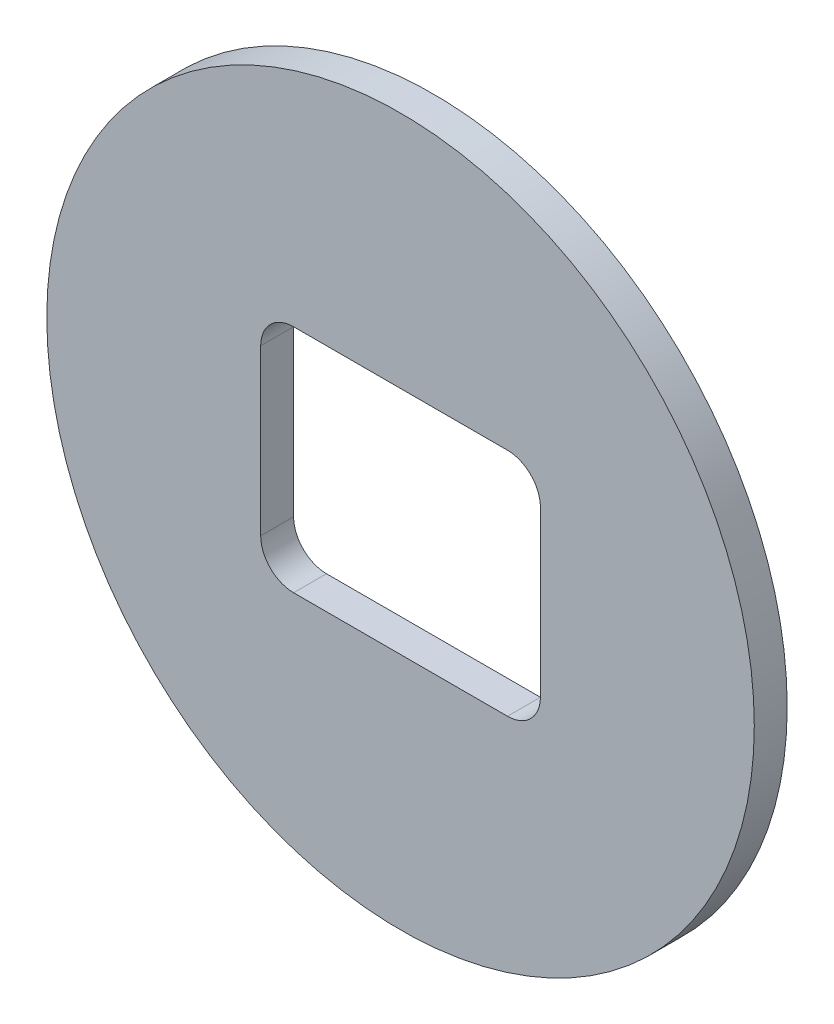
ISO-10303-21;
HEADER;
FILE_DESCRIPTION(('STEP AP214'),'2;1');
FILE_NAME('part.step','',(''),(''),'','','');
FILE_SCHEMA(('AUTOMOTIVE_DESIGN { 1 0 10303 214 1 1 1 1 }'));
ENDSEC;
DATA;
#1=APPLICATION_CONTEXT('core data for automotive mechanical design processes');
#2=APPLICATION_PROTOCOL_DEFINITION('international standard','automotive_design',2000,#1);
#3=PRODUCT_CONTEXT('',#1,'mechanical');
#4=PRODUCT('Part','Part','',(#3));
#5=PRODUCT_RELATED_PRODUCT_CATEGORY('part','',(#4));
#6=PRODUCT_DEFINITION_FORMATION('','',#4);
#7=PRODUCT_DEFINITION_CONTEXT('part definition',#1,'design');
#8=PRODUCT_DEFINITION('design','',#6,#7);
#9=PRODUCT_DEFINITION_SHAPE('','',#8);
#10=(LENGTH_UNIT() NAMED_UNIT(*) SI_UNIT(.MILLI.,.METRE.));
#11=(NAMED_UNIT(*) PLANE_ANGLE_UNIT() SI_UNIT($,.RADIAN.));
#12=(NAMED_UNIT(*) SI_UNIT($,.STERADIAN.) SOLID_ANGLE_UNIT());
#13=UNCERTAINTY_MEASURE_WITH_UNIT(LENGTH_MEASURE(1.E-05),#10,'distance_accuracy_value','');
#14=(GEOMETRIC_REPRESENTATION_CONTEXT(3) GLOBAL_UNCERTAINTY_ASSIGNED_CONTEXT((#13)) GLOBAL_UNIT_ASSIGNED_CONTEXT((#10,
#11,#12)) REPRESENTATION_CONTEXT('',''));
#15=CARTESIAN_POINT('',(0.,0.,0.));
#16=DIRECTION('',(0.,0.,1.));
#17=DIRECTION('',(1.,0.,0.));
#18=AXIS2_PLACEMENT_3D('',#15,#16,#17);
#19=CARTESIAN_POINT('',(0.,0.,2.));
#20=DIRECTION('',(0.,0.,1.));
#21=DIRECTION('',(1.,0.,0.));
#22=AXIS2_PLACEMENT_3D('',#19,#20,#21);
#23=PLANE('',#22);
#24=CARTESIAN_POINT('',(0.,0.,2.));
#25=DIRECTION('',(0.,0.,1.));
#26=DIRECTION('',(1.,0.,0.));
#27=AXIS2_PLACEMENT_3D('',#24,#25,#26);
#28=CIRCLE('',#27,21.5);
#29=CARTESIAN_POINT('',(21.5,0.,2.));
#30=VERTEX_POINT('',#29);
#31=EDGE_CURVE('E117',#30,#30,#28,.T.);
#32=ORIENTED_EDGE('',*,*,#31,.T.);
#33=EDGE_LOOP('',(#32));
#34=FACE_BOUND('',#33,.T.);
#35=DIRECTION('',(-1.,0.,0.));
#36=VECTOR('',#35,1.);
#37=CARTESIAN_POINT('',(-8.5,7.,2.));
#38=LINE('',#37,#36);
#39=CARTESIAN_POINT('',(6.5,7.,2.));
#40=VERTEX_POINT('',#39);
#41=CARTESIAN_POINT('',(-6.5,7.,2.));
#42=VERTEX_POINT('',#41);
#43=EDGE_CURVE('E153',#40,#42,#38,.T.);
#44=ORIENTED_EDGE('',*,*,#43,.F.);
#45=CARTESIAN_POINT('',(6.5,5.,2.));
#46=DIRECTION('',(0.,0.,1.));
#47=DIRECTION('',(1.,0.,0.));
#48=AXIS2_PLACEMENT_3D('',#45,#46,#47);
#49=CIRCLE('',#48,2.);
#50=CARTESIAN_POINT('',(8.5,5.,2.));
#51=VERTEX_POINT('',#50);
#52=EDGE_CURVE('E107',#40,#51,#49,.F.);
#53=ORIENTED_EDGE('',*,*,#52,.T.);
#54=DIRECTION('',(0.,1.,0.));
#55=VECTOR('',#54,1.);
#56=CARTESIAN_POINT('',(8.5,-7.,2.));
#57=LINE('',#56,#55);
#58=CARTESIAN_POINT('',(8.5,-5.,2.));
#59=VERTEX_POINT('',#58);
#60=EDGE_CURVE('E151',#59,#51,#57,.T.);
#61=ORIENTED_EDGE('',*,*,#60,.F.);
#62=CARTESIAN_POINT('',(6.5,-5.,2.));
#63=DIRECTION('',(0.,0.,1.));
#64=DIRECTION('',(1.,0.,0.));
#65=AXIS2_PLACEMENT_3D('',#62,#63,#64);
#66=CIRCLE('',#65,2.);
#67=CARTESIAN_POINT('',(6.5,-7.,2.));
#68=VERTEX_POINT('',#67);
#69=EDGE_CURVE('E144',#59,#68,#66,.F.);
#70=ORIENTED_EDGE('',*,*,#69,.T.);
#71=DIRECTION('',(1.,0.,0.));
#72=VECTOR('',#71,1.);
#73=CARTESIAN_POINT('',(-8.5,-7.,2.));
#74=LINE('',#73,#72);
#75=CARTESIAN_POINT('',(-6.5,-7.,2.));
#76=VERTEX_POINT('',#75);
#77=EDGE_CURVE('E180',#76,#68,#74,.T.);
#78=ORIENTED_EDGE('',*,*,#77,.F.);
#79=CARTESIAN_POINT('',(-6.5,-5.,2.));
#80=DIRECTION('',(0.,0.,1.));
#81=DIRECTION('',(1.,0.,0.));
#82=AXIS2_PLACEMENT_3D('',#79,#80,#81);
#83=CIRCLE('',#82,2.);
#84=CARTESIAN_POINT('',(-8.5,-5.,2.));
#85=VERTEX_POINT('',#84);
#86=EDGE_CURVE('E140',#76,#85,#83,.F.);
#87=ORIENTED_EDGE('',*,*,#86,.T.);
#88=DIRECTION('',(0.,-1.,0.));
#89=VECTOR('',#88,1.);
#90=CARTESIAN_POINT('',(-8.5,-7.,2.));
#91=LINE('',#90,#89);
#92=CARTESIAN_POINT('',(-8.5,5.,2.));
#93=VERTEX_POINT('',#92);
#94=EDGE_CURVE('E179',#93,#85,#91,.T.);
#95=ORIENTED_EDGE('',*,*,#94,.F.);
#96=CARTESIAN_POINT('',(-6.5,5.,2.));
#97=DIRECTION('',(0.,0.,1.));
#98=DIRECTION('',(1.,0.,0.));
#99=AXIS2_PLACEMENT_3D('',#96,#97,#98);
#100=CIRCLE('',#99,2.);
#101=EDGE_CURVE('E11',#93,#42,#100,.F.);
#102=ORIENTED_EDGE('',*,*,#101,.T.);
#103=EDGE_LOOP('',(#44,#53,#61,#70,#78,#87,#95,#102));
#104=FACE_BOUND('',#103,.T.);
#105=ADVANCED_FACE('F33',(#34,#104),#23,.T.);
#106=CARTESIAN_POINT('',(0.,0.,0.));
#107=DIRECTION('',(0.,0.,1.));
#108=DIRECTION('',(1.,0.,0.));
#109=AXIS2_PLACEMENT_3D('',#106,#107,#108);
#110=PLANE('',#109);
#111=CARTESIAN_POINT('',(0.,0.,0.));
#112=DIRECTION('',(0.,0.,1.));
#113=DIRECTION('',(1.,0.,0.));
#114=AXIS2_PLACEMENT_3D('',#111,#112,#113);
#115=CIRCLE('',#114,21.5);
#116=CARTESIAN_POINT('',(21.5,0.,0.));
#117=VERTEX_POINT('',#116);
#118=EDGE_CURVE('E122',#117,#117,#115,.T.);
#119=ORIENTED_EDGE('',*,*,#118,.F.);
#120=EDGE_LOOP('',(#119));
#121=FACE_BOUND('',#120,.T.);
#122=DIRECTION('',(1.,0.,0.));
#123=VECTOR('',#122,1.);
#124=CARTESIAN_POINT('',(-8.5,-7.,0.));
#125=LINE('',#124,#123);
#126=CARTESIAN_POINT('',(-6.5,-7.,0.));
#127=VERTEX_POINT('',#126);
#128=CARTESIAN_POINT('',(6.5,-7.,0.));
#129=VERTEX_POINT('',#128);
#130=EDGE_CURVE('E115',#127,#129,#125,.T.);
#131=ORIENTED_EDGE('',*,*,#130,.T.);
#132=CARTESIAN_POINT('',(6.5,-5.,0.));
#133=DIRECTION('',(0.,0.,1.));
#134=DIRECTION('',(1.,0.,0.));
#135=AXIS2_PLACEMENT_3D('',#132,#133,#134);
#136=CIRCLE('',#135,2.);
#137=CARTESIAN_POINT('',(8.5,-5.,0.));
#138=VERTEX_POINT('',#137);
#139=EDGE_CURVE('E142',#129,#138,#136,.T.);
#140=ORIENTED_EDGE('',*,*,#139,.T.);
#141=DIRECTION('',(0.,1.,0.));
#142=VECTOR('',#141,1.);
#143=CARTESIAN_POINT('',(8.5,-7.,0.));
#144=LINE('',#143,#142);
#145=CARTESIAN_POINT('',(8.5,5.,0.));
#146=VERTEX_POINT('',#145);
#147=EDGE_CURVE('E163',#138,#146,#144,.T.);
#148=ORIENTED_EDGE('',*,*,#147,.T.);
#149=CARTESIAN_POINT('',(6.5,5.,0.));
#150=DIRECTION('',(0.,0.,1.));
#151=DIRECTION('',(1.,0.,0.));
#152=AXIS2_PLACEMENT_3D('',#149,#150,#151);
#153=CIRCLE('',#152,2.);
#154=CARTESIAN_POINT('',(6.5,7.,0.));
#155=VERTEX_POINT('',#154);
#156=EDGE_CURVE('E146',#146,#155,#153,.T.);
#157=ORIENTED_EDGE('',*,*,#156,.T.);
#158=DIRECTION('',(-1.,0.,0.));
#159=VECTOR('',#158,1.);
#160=CARTESIAN_POINT('',(-8.5,7.,0.));
#161=LINE('',#160,#159);
#162=CARTESIAN_POINT('',(-6.5,7.,0.));
#163=VERTEX_POINT('',#162);
#164=EDGE_CURVE('E102',#155,#163,#161,.T.);
#165=ORIENTED_EDGE('',*,*,#164,.T.);
#166=CARTESIAN_POINT('',(-6.5,5.,0.));
#167=DIRECTION('',(0.,0.,1.));
#168=DIRECTION('',(1.,0.,0.));
#169=AXIS2_PLACEMENT_3D('',#166,#167,#168);
#170=CIRCLE('',#169,2.);
#171=CARTESIAN_POINT('',(-8.5,5.,0.));
#172=VERTEX_POINT('',#171);
#173=EDGE_CURVE('E41',#163,#172,#170,.T.);
#174=ORIENTED_EDGE('',*,*,#173,.T.);
#175=DIRECTION('',(0.,-1.,0.));
#176=VECTOR('',#175,1.);
#177=CARTESIAN_POINT('',(-8.5,-7.,0.));
#178=LINE('',#177,#176);
#179=CARTESIAN_POINT('',(-8.5,-5.,0.));
#180=VERTEX_POINT('',#179);
#181=EDGE_CURVE('E101',#172,#180,#178,.T.);
#182=ORIENTED_EDGE('',*,*,#181,.T.);
#183=CARTESIAN_POINT('',(-6.5,-5.,0.));
#184=DIRECTION('',(0.,0.,1.));
#185=DIRECTION('',(1.,0.,0.));
#186=AXIS2_PLACEMENT_3D('',#183,#184,#185);
#187=CIRCLE('',#186,2.);
#188=EDGE_CURVE('E138',#180,#127,#187,.T.);
#189=ORIENTED_EDGE('',*,*,#188,.T.);
#190=EDGE_LOOP('',(#131,#140,#148,#157,#165,#174,#182,#189));
#191=FACE_BOUND('',#190,.T.);
#192=ADVANCED_FACE('F100',(#121,#191),#110,.F.);
#193=CARTESIAN_POINT('',(0.,0.,2.));
#194=DIRECTION('',(0.,0.,-1.));
#195=DIRECTION('',(-1.,0.,0.));
#196=AXIS2_PLACEMENT_3D('',#193,#194,#195);
#197=CYLINDRICAL_SURFACE('',#196,21.5);
#198=ORIENTED_EDGE('',*,*,#31,.F.);
#199=EDGE_LOOP('',(#198));
#200=FACE_BOUND('',#199,.T.);
#201=ORIENTED_EDGE('',*,*,#118,.T.);
#202=EDGE_LOOP('',(#201));
#203=FACE_BOUND('',#202,.T.);
#204=ADVANCED_FACE('F186',(#200,#203),#197,.T.);
#205=CARTESIAN_POINT('',(8.5,-7.,2.));
#206=DIRECTION('',(-1.,0.,0.));
#207=DIRECTION('',(0.,0.,1.));
#208=AXIS2_PLACEMENT_3D('',#205,#206,#207);
#209=PLANE('',#208);
#210=ORIENTED_EDGE('',*,*,#147,.F.);
#211=DIRECTION('',(0.,0.,-1.));
#212=VECTOR('',#211,1.);
#213=CARTESIAN_POINT('',(8.5,-5.,2.));
#214=LINE('',#213,#212);
#215=EDGE_CURVE('E133',#138,#59,#214,.F.);
#216=ORIENTED_EDGE('',*,*,#215,.T.);
#217=ORIENTED_EDGE('',*,*,#60,.T.);
#218=DIRECTION('',(0.,0.,-1.));
#219=VECTOR('',#218,1.);
#220=CARTESIAN_POINT('',(8.5,5.,0.));
#221=LINE('',#220,#219);
#222=EDGE_CURVE('E130',#51,#146,#221,.T.);
#223=ORIENTED_EDGE('',*,*,#222,.T.);
#224=EDGE_LOOP('',(#210,#216,#217,#223));
#225=FACE_BOUND('',#224,.T.);
#226=ADVANCED_FACE('F158',(#225),#209,.T.);
#227=CARTESIAN_POINT('',(-8.5,7.,2.));
#228=DIRECTION('',(0.,-1.,0.));
#229=DIRECTION('',(0.,0.,-1.));
#230=AXIS2_PLACEMENT_3D('',#227,#228,#229);
#231=PLANE('',#230);
#232=ORIENTED_EDGE('',*,*,#164,.F.);
#233=DIRECTION('',(0.,0.,-1.));
#234=VECTOR('',#233,1.);
#235=CARTESIAN_POINT('',(6.5,7.,2.));
#236=LINE('',#235,#234);
#237=EDGE_CURVE('E53',#155,#40,#236,.F.);
#238=ORIENTED_EDGE('',*,*,#237,.T.);
#239=ORIENTED_EDGE('',*,*,#43,.T.);
#240=DIRECTION('',(0.,0.,-1.));
#241=VECTOR('',#240,1.);
#242=CARTESIAN_POINT('',(-6.5,7.,0.));
#243=LINE('',#242,#241);
#244=EDGE_CURVE('E135',#42,#163,#243,.T.);
#245=ORIENTED_EDGE('',*,*,#244,.T.);
#246=EDGE_LOOP('',(#232,#238,#239,#245));
#247=FACE_BOUND('',#246,.T.);
#248=ADVANCED_FACE('F164',(#247),#231,.T.);
#249=CARTESIAN_POINT('',(-8.5,-7.,2.));
#250=DIRECTION('',(1.,0.,0.));
#251=DIRECTION('',(0.,0.,-1.));
#252=AXIS2_PLACEMENT_3D('',#249,#250,#251);
#253=PLANE('',#252);
#254=ORIENTED_EDGE('',*,*,#94,.T.);
#255=DIRECTION('',(0.,0.,-1.));
#256=VECTOR('',#255,1.);
#257=CARTESIAN_POINT('',(-8.5,-5.,0.));
#258=LINE('',#257,#256);
#259=EDGE_CURVE('E114',#85,#180,#258,.T.);
#260=ORIENTED_EDGE('',*,*,#259,.T.);
#261=ORIENTED_EDGE('',*,*,#181,.F.);
#262=DIRECTION('',(0.,0.,-1.));
#263=VECTOR('',#262,1.);
#264=CARTESIAN_POINT('',(-8.5,5.,2.));
#265=LINE('',#264,#263);
#266=EDGE_CURVE('E112',#172,#93,#265,.F.);
#267=ORIENTED_EDGE('',*,*,#266,.T.);
#268=EDGE_LOOP('',(#254,#260,#261,#267));
#269=FACE_BOUND('',#268,.T.);
#270=ADVANCED_FACE('F111',(#269),#253,.T.);
#271=CARTESIAN_POINT('',(-8.5,-7.,2.));
#272=DIRECTION('',(0.,1.,0.));
#273=DIRECTION('',(0.,0.,1.));
#274=AXIS2_PLACEMENT_3D('',#271,#272,#273);
#275=PLANE('',#274);
#276=ORIENTED_EDGE('',*,*,#130,.F.);
#277=DIRECTION('',(0.,0.,-1.));
#278=VECTOR('',#277,1.);
#279=CARTESIAN_POINT('',(-6.5,-7.,2.));
#280=LINE('',#279,#278);
#281=EDGE_CURVE('E128',#127,#76,#280,.F.);
#282=ORIENTED_EDGE('',*,*,#281,.T.);
#283=ORIENTED_EDGE('',*,*,#77,.T.);
#284=DIRECTION('',(0.,0.,-1.));
#285=VECTOR('',#284,1.);
#286=CARTESIAN_POINT('',(6.5,-7.,0.));
#287=LINE('',#286,#285);
#288=EDGE_CURVE('E119',#68,#129,#287,.T.);
#289=ORIENTED_EDGE('',*,*,#288,.T.);
#290=EDGE_LOOP('',(#276,#282,#283,#289));
#291=FACE_BOUND('',#290,.T.);
#292=ADVANCED_FACE('F172',(#291),#275,.T.);
#293=CARTESIAN_POINT('',(-6.5,-5.,2.));
#294=DIRECTION('',(0.,0.,1.));
#295=DIRECTION('',(1.,0.,0.));
#296=AXIS2_PLACEMENT_3D('',#293,#294,#295);
#297=CYLINDRICAL_SURFACE('',#296,2.);
#298=ORIENTED_EDGE('',*,*,#86,.F.);
#299=ORIENTED_EDGE('',*,*,#281,.F.);
#300=ORIENTED_EDGE('',*,*,#188,.F.);
#301=ORIENTED_EDGE('',*,*,#259,.F.);
#302=EDGE_LOOP('',(#298,#299,#300,#301));
#303=FACE_BOUND('',#302,.T.);
#304=ADVANCED_FACE('F178',(#303),#297,.F.);
#305=CARTESIAN_POINT('',(6.5,-5.,2.));
#306=DIRECTION('',(0.,0.,1.));
#307=DIRECTION('',(1.,0.,0.));
#308=AXIS2_PLACEMENT_3D('',#305,#306,#307);
#309=CYLINDRICAL_SURFACE('',#308,2.);
#310=ORIENTED_EDGE('',*,*,#69,.F.);
#311=ORIENTED_EDGE('',*,*,#215,.F.);
#312=ORIENTED_EDGE('',*,*,#139,.F.);
#313=ORIENTED_EDGE('',*,*,#288,.F.);
#314=EDGE_LOOP('',(#310,#311,#312,#313));
#315=FACE_BOUND('',#314,.T.);
#316=ADVANCED_FACE('F202',(#315),#309,.F.);
#317=CARTESIAN_POINT('',(6.5,5.,2.));
#318=DIRECTION('',(0.,0.,1.));
#319=DIRECTION('',(1.,0.,0.));
#320=AXIS2_PLACEMENT_3D('',#317,#318,#319);
#321=CYLINDRICAL_SURFACE('',#320,2.);
#322=ORIENTED_EDGE('',*,*,#52,.F.);
#323=ORIENTED_EDGE('',*,*,#237,.F.);
#324=ORIENTED_EDGE('',*,*,#156,.F.);
#325=ORIENTED_EDGE('',*,*,#222,.F.);
#326=EDGE_LOOP('',(#322,#323,#324,#325));
#327=FACE_BOUND('',#326,.T.);
#328=ADVANCED_FACE('F162',(#327),#321,.F.);
#329=CARTESIAN_POINT('',(-6.5,5.,2.));
#330=DIRECTION('',(0.,0.,1.));
#331=DIRECTION('',(1.,0.,0.));
#332=AXIS2_PLACEMENT_3D('',#329,#330,#331);
#333=CYLINDRICAL_SURFACE('',#332,2.);
#334=ORIENTED_EDGE('',*,*,#101,.F.);
#335=ORIENTED_EDGE('',*,*,#266,.F.);
#336=ORIENTED_EDGE('',*,*,#173,.F.);
#337=ORIENTED_EDGE('',*,*,#244,.F.);
#338=EDGE_LOOP('',(#334,#335,#336,#337));
#339=FACE_BOUND('',#338,.T.);
#340=ADVANCED_FACE('F35',(#339),#333,.F.);
#341=CLOSED_SHELL('',(#105,#192,#204,#226,#248,#270,#292,#304,#316,#328,#340));
#342=MANIFOLD_SOLID_BREP('B2',#341);
#343=ADVANCED_BREP_SHAPE_REPRESENTATION('',(#18,#342),#14);
#344=SHAPE_DEFINITION_REPRESENTATION(#9,#343);
ENDSEC;
END-ISO-10303-21;
